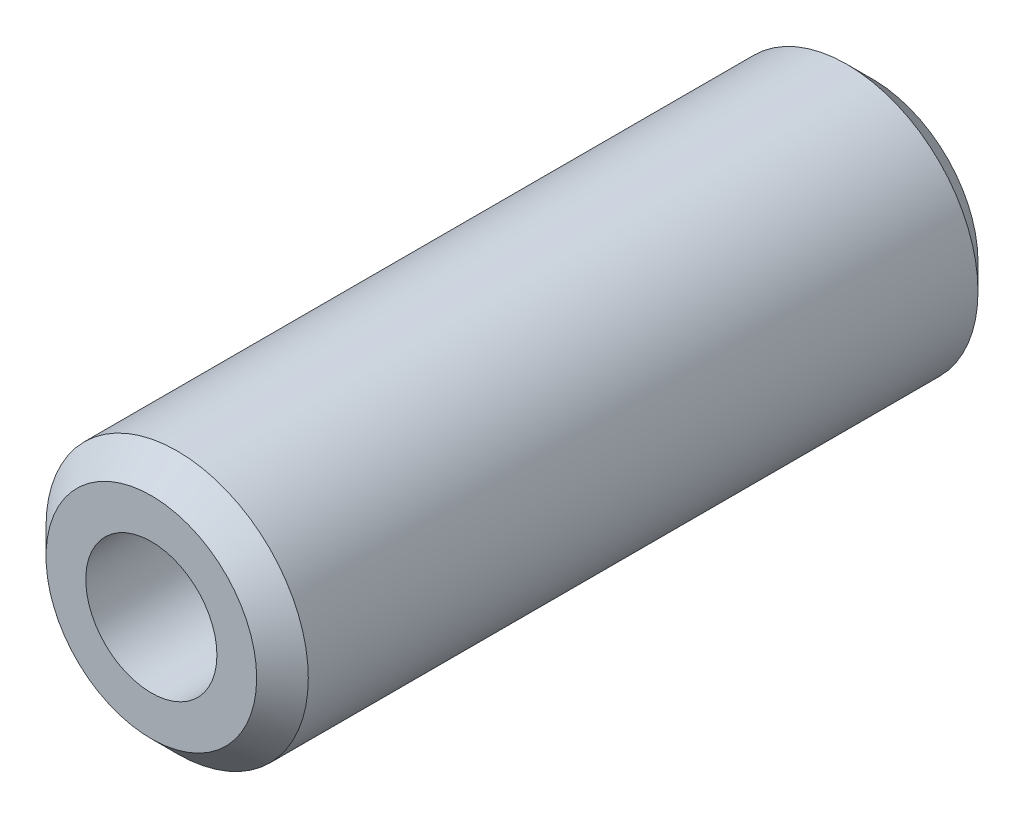
ISO-10303-21;
HEADER;
FILE_DESCRIPTION(('STEP AP214'),'2;1');
FILE_NAME('part.step','',(''),(''),'','','');
FILE_SCHEMA(('AUTOMOTIVE_DESIGN { 1 0 10303 214 1 1 1 1 }'));
ENDSEC;
DATA;
#1=APPLICATION_CONTEXT('core data for automotive mechanical design processes');
#2=APPLICATION_PROTOCOL_DEFINITION('international standard','automotive_design',2000,#1);
#3=PRODUCT_CONTEXT('',#1,'mechanical');
#4=PRODUCT('Part','Part','',(#3));
#5=PRODUCT_RELATED_PRODUCT_CATEGORY('part','',(#4));
#6=PRODUCT_DEFINITION_FORMATION('','',#4);
#7=PRODUCT_DEFINITION_CONTEXT('part definition',#1,'design');
#8=PRODUCT_DEFINITION('design','',#6,#7);
#9=PRODUCT_DEFINITION_SHAPE('','',#8);
#10=(LENGTH_UNIT() NAMED_UNIT(*) SI_UNIT(.MILLI.,.METRE.));
#11=(NAMED_UNIT(*) PLANE_ANGLE_UNIT() SI_UNIT($,.RADIAN.));
#12=(NAMED_UNIT(*) SI_UNIT($,.STERADIAN.) SOLID_ANGLE_UNIT());
#13=UNCERTAINTY_MEASURE_WITH_UNIT(LENGTH_MEASURE(1.E-05),#10,'distance_accuracy_value','');
#14=(GEOMETRIC_REPRESENTATION_CONTEXT(3) GLOBAL_UNCERTAINTY_ASSIGNED_CONTEXT((#13)) GLOBAL_UNIT_ASSIGNED_CONTEXT((#10,
#11,#12)) REPRESENTATION_CONTEXT('',''));
#15=CARTESIAN_POINT('',(0.,0.,0.));
#16=DIRECTION('',(0.,0.,1.));
#17=DIRECTION('',(1.,0.,0.));
#18=AXIS2_PLACEMENT_3D('',#15,#16,#17);
#19=CARTESIAN_POINT('',(0.,0.,34.925));
#20=DIRECTION('',(0.,0.,1.));
#21=DIRECTION('',(1.,0.,0.));
#22=AXIS2_PLACEMENT_3D('',#19,#20,#21);
#23=PLANE('',#22);
#24=CARTESIAN_POINT('',(0.,0.,34.925));
#25=DIRECTION('',(0.,0.,1.));
#26=DIRECTION('',(1.,0.,0.));
#27=AXIS2_PLACEMENT_3D('',#24,#25,#26);
#28=CIRCLE('',#27,10.2);
#29=CARTESIAN_POINT('',(10.2,0.,34.925));
#30=VERTEX_POINT('',#29);
#31=EDGE_CURVE('E10',#30,#30,#28,.T.);
#32=ORIENTED_EDGE('',*,*,#31,.T.);
#33=EDGE_LOOP('',(#32));
#34=FACE_BOUND('',#33,.T.);
#35=CARTESIAN_POINT('',(0.,0.,34.925));
#36=DIRECTION('',(0.,0.,1.));
#37=DIRECTION('',(1.,0.,0.));
#38=AXIS2_PLACEMENT_3D('',#35,#36,#37);
#39=CIRCLE('',#38,6.35);
#40=CARTESIAN_POINT('',(6.35,0.,34.925));
#41=VERTEX_POINT('',#40);
#42=EDGE_CURVE('E61',#41,#41,#39,.T.);
#43=ORIENTED_EDGE('',*,*,#42,.F.);
#44=EDGE_LOOP('',(#43));
#45=FACE_BOUND('',#44,.T.);
#46=ADVANCED_FACE('F37',(#34,#45),#23,.T.);
#47=CARTESIAN_POINT('',(0.,0.,-34.925));
#48=DIRECTION('',(0.,0.,1.));
#49=DIRECTION('',(1.,0.,0.));
#50=AXIS2_PLACEMENT_3D('',#47,#48,#49);
#51=PLANE('',#50);
#52=CARTESIAN_POINT('',(0.,0.,-34.925));
#53=DIRECTION('',(0.,0.,1.));
#54=DIRECTION('',(1.,0.,0.));
#55=AXIS2_PLACEMENT_3D('',#52,#53,#54);
#56=CIRCLE('',#55,10.2);
#57=CARTESIAN_POINT('',(10.2,0.,-34.925));
#58=VERTEX_POINT('',#57);
#59=EDGE_CURVE('E45',#58,#58,#56,.F.);
#60=ORIENTED_EDGE('',*,*,#59,.T.);
#61=EDGE_LOOP('',(#60));
#62=FACE_BOUND('',#61,.T.);
#63=CARTESIAN_POINT('',(0.,0.,-34.925));
#64=DIRECTION('',(0.,0.,1.));
#65=DIRECTION('',(1.,0.,0.));
#66=AXIS2_PLACEMENT_3D('',#63,#64,#65);
#67=CIRCLE('',#66,6.35);
#68=CARTESIAN_POINT('',(6.35,0.,-34.925));
#69=VERTEX_POINT('',#68);
#70=EDGE_CURVE('E62',#69,#69,#67,.T.);
#71=ORIENTED_EDGE('',*,*,#70,.T.);
#72=EDGE_LOOP('',(#71));
#73=FACE_BOUND('',#72,.T.);
#74=ADVANCED_FACE('F74',(#62,#73),#51,.F.);
#75=CARTESIAN_POINT('',(0.,0.,34.925));
#76=DIRECTION('',(0.,0.,-1.));
#77=DIRECTION('',(-1.,0.,0.));
#78=AXIS2_PLACEMENT_3D('',#75,#76,#77);
#79=CYLINDRICAL_SURFACE('',#78,12.7);
#80=CARTESIAN_POINT('',(0.,0.,-32.425));
#81=DIRECTION('',(0.,0.,1.));
#82=DIRECTION('',(1.,0.,0.));
#83=AXIS2_PLACEMENT_3D('',#80,#81,#82);
#84=CIRCLE('',#83,12.7);
#85=CARTESIAN_POINT('',(12.7,0.,-32.425));
#86=VERTEX_POINT('',#85);
#87=EDGE_CURVE('E50',#86,#86,#84,.T.);
#88=ORIENTED_EDGE('',*,*,#87,.T.);
#89=EDGE_LOOP('',(#88));
#90=FACE_BOUND('',#89,.T.);
#91=CARTESIAN_POINT('',(0.,0.,32.425));
#92=DIRECTION('',(0.,0.,1.));
#93=DIRECTION('',(1.,0.,0.));
#94=AXIS2_PLACEMENT_3D('',#91,#92,#93);
#95=CIRCLE('',#94,12.7);
#96=CARTESIAN_POINT('',(12.7,0.,32.425));
#97=VERTEX_POINT('',#96);
#98=EDGE_CURVE('E55',#97,#97,#95,.F.);
#99=ORIENTED_EDGE('',*,*,#98,.T.);
#100=EDGE_LOOP('',(#99));
#101=FACE_BOUND('',#100,.T.);
#102=ADVANCED_FACE('F79',(#90,#101),#79,.T.);
#103=CARTESIAN_POINT('',(0.,0.,34.925));
#104=DIRECTION('',(0.,0.,-1.));
#105=DIRECTION('',(-1.,0.,0.));
#106=AXIS2_PLACEMENT_3D('',#103,#104,#105);
#107=CYLINDRICAL_SURFACE('',#106,6.35);
#108=ORIENTED_EDGE('',*,*,#42,.T.);
#109=EDGE_LOOP('',(#108));
#110=FACE_BOUND('',#109,.T.);
#111=ORIENTED_EDGE('',*,*,#70,.F.);
#112=EDGE_LOOP('',(#111));
#113=FACE_BOUND('',#112,.T.);
#114=ADVANCED_FACE('F70',(#110,#113),#107,.F.);
#115=CARTESIAN_POINT('',(0.,0.,-32.425));
#116=DIRECTION('',(0.,0.,1.));
#117=DIRECTION('',(1.,0.,0.));
#118=AXIS2_PLACEMENT_3D('',#115,#116,#117);
#119=CONICAL_SURFACE('',#118,12.7,0.785398163397449);
#120=ORIENTED_EDGE('',*,*,#59,.F.);
#121=EDGE_LOOP('',(#120));
#122=FACE_BOUND('',#121,.T.);
#123=ORIENTED_EDGE('',*,*,#87,.F.);
#124=EDGE_LOOP('',(#123));
#125=FACE_BOUND('',#124,.T.);
#126=ADVANCED_FACE('F85',(#122,#125),#119,.T.);
#127=CARTESIAN_POINT('',(0.,0.,34.925));
#128=DIRECTION('',(0.,0.,-1.));
#129=DIRECTION('',(-1.,0.,0.));
#130=AXIS2_PLACEMENT_3D('',#127,#128,#129);
#131=CONICAL_SURFACE('',#130,10.2,0.785398163397446);
#132=ORIENTED_EDGE('',*,*,#98,.F.);
#133=EDGE_LOOP('',(#132));
#134=FACE_BOUND('',#133,.T.);
#135=ORIENTED_EDGE('',*,*,#31,.F.);
#136=EDGE_LOOP('',(#135));
#137=FACE_BOUND('',#136,.T.);
#138=ADVANCED_FACE('F39',(#134,#137),#131,.T.);
#139=CLOSED_SHELL('',(#46,#74,#102,#114,#126,#138));
#140=MANIFOLD_SOLID_BREP('B2',#139);
#141=ADVANCED_BREP_SHAPE_REPRESENTATION('',(#18,#140),#14);
#142=SHAPE_DEFINITION_REPRESENTATION(#9,#141);
ENDSEC;
END-ISO-10303-21;
